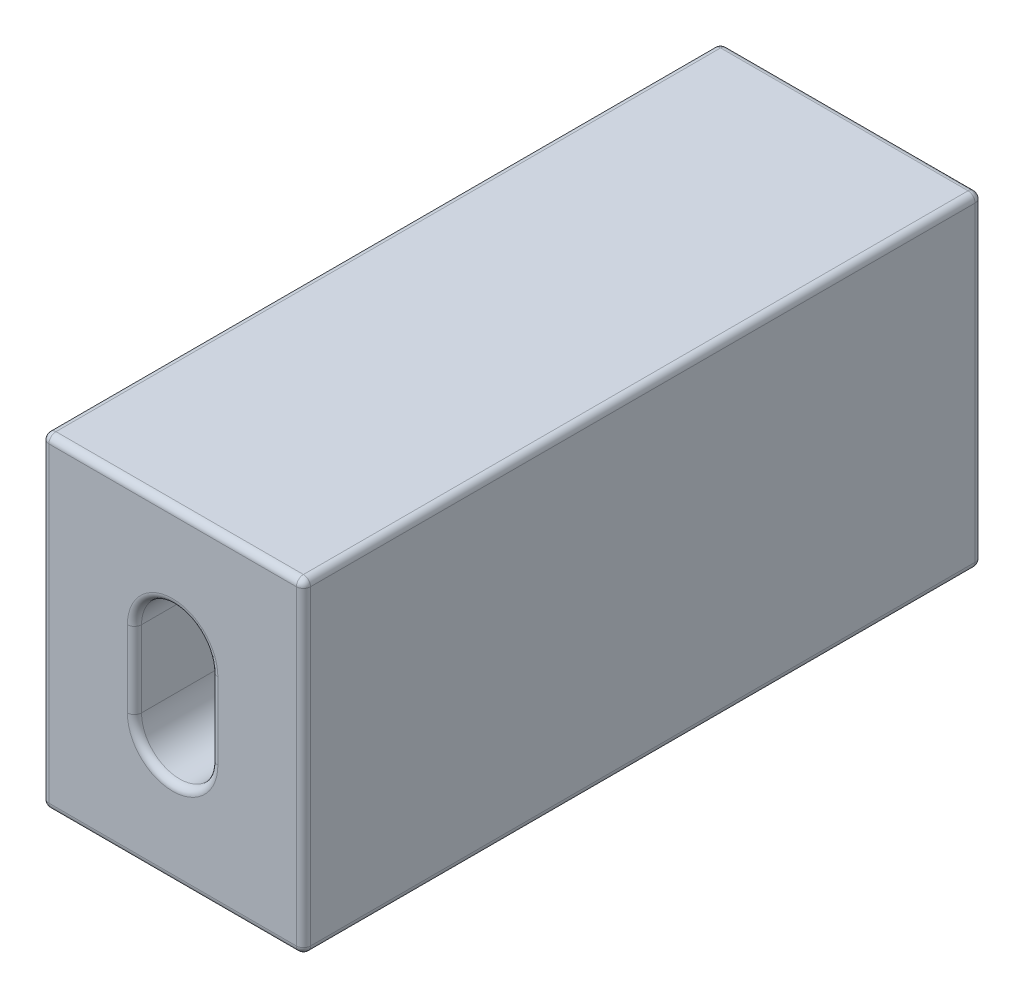
ISO-10303-21;
HEADER;
FILE_DESCRIPTION(('STEP AP214'),'2;1');
FILE_NAME('part.step','',(''),(''),'','','');
FILE_SCHEMA(('AUTOMOTIVE_DESIGN { 1 0 10303 214 1 1 1 1 }'));
ENDSEC;
DATA;
#1=APPLICATION_CONTEXT('core data for automotive mechanical design processes');
#2=APPLICATION_PROTOCOL_DEFINITION('international standard','automotive_design',2000,#1);
#3=PRODUCT_CONTEXT('',#1,'mechanical');
#4=PRODUCT('Part','Part','',(#3));
#5=PRODUCT_RELATED_PRODUCT_CATEGORY('part','',(#4));
#6=PRODUCT_DEFINITION_FORMATION('','',#4);
#7=PRODUCT_DEFINITION_CONTEXT('part definition',#1,'design');
#8=PRODUCT_DEFINITION('design','',#6,#7);
#9=PRODUCT_DEFINITION_SHAPE('','',#8);
#10=(LENGTH_UNIT() NAMED_UNIT(*) SI_UNIT(.MILLI.,.METRE.));
#11=(NAMED_UNIT(*) PLANE_ANGLE_UNIT() SI_UNIT($,.RADIAN.));
#12=(NAMED_UNIT(*) SI_UNIT($,.STERADIAN.) SOLID_ANGLE_UNIT());
#13=UNCERTAINTY_MEASURE_WITH_UNIT(LENGTH_MEASURE(1.E-05),#10,'distance_accuracy_value','');
#14=(GEOMETRIC_REPRESENTATION_CONTEXT(3) GLOBAL_UNCERTAINTY_ASSIGNED_CONTEXT((#13)) GLOBAL_UNIT_ASSIGNED_CONTEXT((#10,
#11,#12)) REPRESENTATION_CONTEXT('',''));
#15=CARTESIAN_POINT('',(0.,0.,0.));
#16=DIRECTION('',(0.,0.,1.));
#17=DIRECTION('',(1.,0.,0.));
#18=AXIS2_PLACEMENT_3D('',#15,#16,#17);
#19=CARTESIAN_POINT('',(0.700000000000002,25.85,48.));
#20=DIRECTION('',(0.,0.,-1.));
#21=DIRECTION('',(-1.,0.,0.));
#22=AXIS2_PLACEMENT_3D('',#19,#20,#21);
#23=PLANE('',#22);
#24=CARTESIAN_POINT('',(9.45,12.1499999999997,48.));
#25=DIRECTION('',(0.,0.,-1.));
#26=DIRECTION('',(-1.,0.,0.));
#27=AXIS2_PLACEMENT_3D('',#24,#25,#26);
#28=CIRCLE('',#27,3.2);
#29=CARTESIAN_POINT('',(12.65,12.1499999999997,48.));
#30=VERTEX_POINT('',#29);
#31=CARTESIAN_POINT('',(6.25,12.1499999999997,48.));
#32=VERTEX_POINT('',#31);
#33=EDGE_CURVE('E345',#30,#32,#28,.T.);
#34=ORIENTED_EDGE('',*,*,#33,.T.);
#35=DIRECTION('',(0.,-1.,0.));
#36=VECTOR('',#35,1.);
#37=CARTESIAN_POINT('',(6.25,17.5499999999997,48.));
#38=LINE('',#37,#36);
#39=CARTESIAN_POINT('',(6.24999999999998,17.5499999999997,48.));
#40=VERTEX_POINT('',#39);
#41=EDGE_CURVE('E348',#32,#40,#38,.F.);
#42=ORIENTED_EDGE('',*,*,#41,.T.);
#43=CARTESIAN_POINT('',(9.44999999999998,17.5499999999997,48.));
#44=DIRECTION('',(0.,0.,-1.));
#45=DIRECTION('',(-1.,0.,0.));
#46=AXIS2_PLACEMENT_3D('',#43,#44,#45);
#47=CIRCLE('',#46,3.2);
#48=CARTESIAN_POINT('',(12.65,17.5499999999997,48.));
#49=VERTEX_POINT('',#48);
#50=EDGE_CURVE('E339',#40,#49,#47,.T.);
#51=ORIENTED_EDGE('',*,*,#50,.T.);
#52=DIRECTION('',(0.,1.,0.));
#53=VECTOR('',#52,1.);
#54=CARTESIAN_POINT('',(12.65,12.1499999999997,48.));
#55=LINE('',#54,#53);
#56=EDGE_CURVE('E342',#49,#30,#55,.F.);
#57=ORIENTED_EDGE('',*,*,#56,.T.);
#58=EDGE_LOOP('',(#34,#42,#51,#57));
#59=FACE_BOUND('',#58,.T.);
#60=DIRECTION('',(0.,1.,0.));
#61=VECTOR('',#60,1.);
#62=CARTESIAN_POINT('',(18.2,25.85,48.));
#63=LINE('',#62,#61);
#64=CARTESIAN_POINT('',(18.2,3.84999999999973,48.));
#65=VERTEX_POINT('',#64);
#66=CARTESIAN_POINT('',(18.2,25.85,48.));
#67=VERTEX_POINT('',#66);
#68=EDGE_CURVE('E332',#65,#67,#63,.T.);
#69=ORIENTED_EDGE('',*,*,#68,.T.);
#70=DIRECTION('',(-1.,0.,0.));
#71=VECTOR('',#70,1.);
#72=CARTESIAN_POINT('',(0.700000000000002,25.85,48.));
#73=LINE('',#72,#71);
#74=CARTESIAN_POINT('',(0.700000000000002,25.85,48.));
#75=VERTEX_POINT('',#74);
#76=EDGE_CURVE('E335',#67,#75,#73,.T.);
#77=ORIENTED_EDGE('',*,*,#76,.T.);
#78=DIRECTION('',(0.,-1.,0.));
#79=VECTOR('',#78,1.);
#80=CARTESIAN_POINT('',(0.700000000000002,25.85,48.));
#81=LINE('',#80,#79);
#82=CARTESIAN_POINT('',(0.700000000000002,3.84999999999973,48.));
#83=VERTEX_POINT('',#82);
#84=EDGE_CURVE('E326',#75,#83,#81,.T.);
#85=ORIENTED_EDGE('',*,*,#84,.T.);
#86=DIRECTION('',(1.,0.,0.));
#87=VECTOR('',#86,1.);
#88=CARTESIAN_POINT('',(0.700000000000002,3.84999999999973,48.));
#89=LINE('',#88,#87);
#90=EDGE_CURVE('E329',#83,#65,#89,.T.);
#91=ORIENTED_EDGE('',*,*,#90,.T.);
#92=EDGE_LOOP('',(#69,#77,#85,#91));
#93=FACE_BOUND('',#92,.T.);
#94=ADVANCED_FACE('F43',(#59,#93),#23,.F.);
#95=CARTESIAN_POINT('',(0.700000000000002,25.85,0.));
#96=DIRECTION('',(0.,0.,-1.));
#97=DIRECTION('',(-1.,0.,0.));
#98=AXIS2_PLACEMENT_3D('',#95,#96,#97);
#99=PLANE('',#98);
#100=DIRECTION('',(0.,-1.,0.));
#101=VECTOR('',#100,1.);
#102=CARTESIAN_POINT('',(6.25,25.85,0.));
#103=LINE('',#102,#101);
#104=CARTESIAN_POINT('',(6.24999999999998,17.5499999999997,0.));
#105=VERTEX_POINT('',#104);
#106=CARTESIAN_POINT('',(6.25,12.1499999999997,0.));
#107=VERTEX_POINT('',#106);
#108=EDGE_CURVE('E236',#105,#107,#103,.T.);
#109=ORIENTED_EDGE('',*,*,#108,.T.);
#110=CARTESIAN_POINT('',(9.45,12.1499999999997,0.));
#111=DIRECTION('',(0.,0.,-1.));
#112=DIRECTION('',(-1.,0.,0.));
#113=AXIS2_PLACEMENT_3D('',#110,#111,#112);
#114=CIRCLE('',#113,3.2);
#115=CARTESIAN_POINT('',(12.65,12.1499999999997,0.));
#116=VERTEX_POINT('',#115);
#117=EDGE_CURVE('E239',#107,#116,#114,.F.);
#118=ORIENTED_EDGE('',*,*,#117,.T.);
#119=DIRECTION('',(0.,1.,0.));
#120=VECTOR('',#119,1.);
#121=CARTESIAN_POINT('',(12.65,25.85,0.));
#122=LINE('',#121,#120);
#123=CARTESIAN_POINT('',(12.65,17.5499999999997,0.));
#124=VERTEX_POINT('',#123);
#125=EDGE_CURVE('E225',#116,#124,#122,.T.);
#126=ORIENTED_EDGE('',*,*,#125,.T.);
#127=CARTESIAN_POINT('',(9.44999999999998,17.5499999999997,0.));
#128=DIRECTION('',(0.,0.,-1.));
#129=DIRECTION('',(-1.,0.,0.));
#130=AXIS2_PLACEMENT_3D('',#127,#128,#129);
#131=CIRCLE('',#130,3.2);
#132=EDGE_CURVE('E229',#124,#105,#131,.F.);
#133=ORIENTED_EDGE('',*,*,#132,.T.);
#134=EDGE_LOOP('',(#109,#118,#126,#133));
#135=FACE_BOUND('',#134,.T.);
#136=DIRECTION('',(1.,0.,0.));
#137=VECTOR('',#136,1.);
#138=CARTESIAN_POINT('',(0.700000000000002,3.84999999999973,0.));
#139=LINE('',#138,#137);
#140=CARTESIAN_POINT('',(18.2,3.84999999999973,0.));
#141=VERTEX_POINT('',#140);
#142=CARTESIAN_POINT('',(0.700000000000002,3.84999999999973,0.));
#143=VERTEX_POINT('',#142);
#144=EDGE_CURVE('E222',#141,#143,#139,.F.);
#145=ORIENTED_EDGE('',*,*,#144,.T.);
#146=DIRECTION('',(0.,-1.,0.));
#147=VECTOR('',#146,1.);
#148=CARTESIAN_POINT('',(0.700000000000002,25.85,0.));
#149=LINE('',#148,#147);
#150=CARTESIAN_POINT('',(0.700000000000002,25.85,0.));
#151=VERTEX_POINT('',#150);
#152=EDGE_CURVE('E188',#143,#151,#149,.F.);
#153=ORIENTED_EDGE('',*,*,#152,.T.);
#154=DIRECTION('',(-1.,0.,0.));
#155=VECTOR('',#154,1.);
#156=CARTESIAN_POINT('',(18.2,25.85,0.));
#157=LINE('',#156,#155);
#158=CARTESIAN_POINT('',(18.2,25.85,0.));
#159=VERTEX_POINT('',#158);
#160=EDGE_CURVE('E210',#151,#159,#157,.F.);
#161=ORIENTED_EDGE('',*,*,#160,.T.);
#162=DIRECTION('',(0.,1.,0.));
#163=VECTOR('',#162,1.);
#164=CARTESIAN_POINT('',(18.2,3.84999999999973,0.));
#165=LINE('',#164,#163);
#166=EDGE_CURVE('E217',#159,#141,#165,.F.);
#167=ORIENTED_EDGE('',*,*,#166,.T.);
#168=EDGE_LOOP('',(#145,#153,#161,#167));
#169=FACE_BOUND('',#168,.T.);
#170=ADVANCED_FACE('F220',(#135,#169),#99,.T.);
#171=CARTESIAN_POINT('',(0.700000000000002,25.85,48.));
#172=DIRECTION('',(0.,0.,-1.));
#173=DIRECTION('',(-1.,0.,0.));
#174=AXIS2_PLACEMENT_3D('',#171,#172,#173);
#175=CYLINDRICAL_SURFACE('',#174,0.5);
#176=DIRECTION('',(0.,0.,-1.));
#177=VECTOR('',#176,1.);
#178=CARTESIAN_POINT('',(0.200000000000002,25.85,48.));
#179=LINE('',#178,#177);
#180=CARTESIAN_POINT('',(0.200000000000002,25.85,47.5));
#181=VERTEX_POINT('',#180);
#182=CARTESIAN_POINT('',(0.200000000000002,25.85,0.5));
#183=VERTEX_POINT('',#182);
#184=EDGE_CURVE('E218',#181,#183,#179,.T.);
#185=ORIENTED_EDGE('',*,*,#184,.F.);
#186=CARTESIAN_POINT('',(0.700000000000002,25.85,47.5));
#187=DIRECTION('',(0.,0.,-1.));
#188=DIRECTION('',(-1.,0.,0.));
#189=AXIS2_PLACEMENT_3D('',#186,#187,#188);
#190=CIRCLE('',#189,0.5);
#191=CARTESIAN_POINT('',(0.700000000000002,26.35,47.5));
#192=VERTEX_POINT('',#191);
#193=EDGE_CURVE('E11',#181,#192,#190,.T.);
#194=ORIENTED_EDGE('',*,*,#193,.T.);
#195=DIRECTION('',(0.,0.,-1.));
#196=VECTOR('',#195,1.);
#197=CARTESIAN_POINT('',(0.700000000000002,26.35,48.));
#198=LINE('',#197,#196);
#199=CARTESIAN_POINT('',(0.700000000000002,26.35,0.5));
#200=VERTEX_POINT('',#199);
#201=EDGE_CURVE('E470',#192,#200,#198,.T.);
#202=ORIENTED_EDGE('',*,*,#201,.T.);
#203=CARTESIAN_POINT('',(0.700000000000002,25.85,0.5));
#204=DIRECTION('',(0.,0.,-1.));
#205=DIRECTION('',(-1.,0.,0.));
#206=AXIS2_PLACEMENT_3D('',#203,#204,#205);
#207=CIRCLE('',#206,0.5);
#208=EDGE_CURVE('E203',#200,#183,#207,.F.);
#209=ORIENTED_EDGE('',*,*,#208,.T.);
#210=EDGE_LOOP('',(#185,#194,#202,#209));
#211=FACE_BOUND('',#210,.T.);
#212=ADVANCED_FACE('F468',(#211),#175,.T.);
#213=CARTESIAN_POINT('',(0.200000000000002,3.84999999999973,48.));
#214=DIRECTION('',(1.,0.,0.));
#215=DIRECTION('',(0.,0.,-1.));
#216=AXIS2_PLACEMENT_3D('',#213,#214,#215);
#217=PLANE('',#216);
#218=DIRECTION('',(0.,0.,-1.));
#219=VECTOR('',#218,1.);
#220=CARTESIAN_POINT('',(0.200000000000002,3.84999999999973,48.));
#221=LINE('',#220,#219);
#222=CARTESIAN_POINT('',(0.200000000000002,3.84999999999973,47.5));
#223=VERTEX_POINT('',#222);
#224=CARTESIAN_POINT('',(0.200000000000002,3.84999999999973,0.5));
#225=VERTEX_POINT('',#224);
#226=EDGE_CURVE('E441',#223,#225,#221,.T.);
#227=ORIENTED_EDGE('',*,*,#226,.F.);
#228=DIRECTION('',(0.,-1.,0.));
#229=VECTOR('',#228,1.);
#230=CARTESIAN_POINT('',(0.200000000000002,3.84999999999973,47.5));
#231=LINE('',#230,#229);
#232=EDGE_CURVE('E53',#223,#181,#231,.F.);
#233=ORIENTED_EDGE('',*,*,#232,.T.);
#234=ORIENTED_EDGE('',*,*,#184,.T.);
#235=DIRECTION('',(0.,-1.,0.));
#236=VECTOR('',#235,1.);
#237=CARTESIAN_POINT('',(0.200000000000002,3.84999999999973,0.5));
#238=LINE('',#237,#236);
#239=EDGE_CURVE('E191',#183,#225,#238,.T.);
#240=ORIENTED_EDGE('',*,*,#239,.T.);
#241=EDGE_LOOP('',(#227,#233,#234,#240));
#242=FACE_BOUND('',#241,.T.);
#243=ADVANCED_FACE('F465',(#242),#217,.F.);
#244=CARTESIAN_POINT('',(0.700000000000002,3.84999999999973,48.));
#245=DIRECTION('',(0.,0.,-1.));
#246=DIRECTION('',(-1.,0.,0.));
#247=AXIS2_PLACEMENT_3D('',#244,#245,#246);
#248=CYLINDRICAL_SURFACE('',#247,0.5);
#249=DIRECTION('',(0.,0.,-1.));
#250=VECTOR('',#249,1.);
#251=CARTESIAN_POINT('',(0.700000000000002,3.34999999999973,48.));
#252=LINE('',#251,#250);
#253=CARTESIAN_POINT('',(0.700000000000002,3.34999999999973,47.5));
#254=VERTEX_POINT('',#253);
#255=CARTESIAN_POINT('',(0.700000000000002,3.34999999999973,0.5));
#256=VERTEX_POINT('',#255);
#257=EDGE_CURVE('E435',#254,#256,#252,.T.);
#258=ORIENTED_EDGE('',*,*,#257,.F.);
#259=CARTESIAN_POINT('',(0.700000000000002,3.84999999999973,47.5));
#260=DIRECTION('',(0.,0.,-1.));
#261=DIRECTION('',(-1.,0.,0.));
#262=AXIS2_PLACEMENT_3D('',#259,#260,#261);
#263=CIRCLE('',#262,0.5);
#264=EDGE_CURVE('E68',#254,#223,#263,.T.);
#265=ORIENTED_EDGE('',*,*,#264,.T.);
#266=ORIENTED_EDGE('',*,*,#226,.T.);
#267=CARTESIAN_POINT('',(0.700000000000002,3.84999999999973,0.5));
#268=DIRECTION('',(0.,0.,-1.));
#269=DIRECTION('',(-1.,0.,0.));
#270=AXIS2_PLACEMENT_3D('',#267,#268,#269);
#271=CIRCLE('',#270,0.5);
#272=EDGE_CURVE('E261',#225,#256,#271,.F.);
#273=ORIENTED_EDGE('',*,*,#272,.T.);
#274=EDGE_LOOP('',(#258,#265,#266,#273));
#275=FACE_BOUND('',#274,.T.);
#276=ADVANCED_FACE('F437',(#275),#248,.T.);
#277=CARTESIAN_POINT('',(0.700000000000002,3.34999999999973,48.));
#278=DIRECTION('',(0.,1.,0.));
#279=DIRECTION('',(0.,0.,1.));
#280=AXIS2_PLACEMENT_3D('',#277,#278,#279);
#281=PLANE('',#280);
#282=DIRECTION('',(0.,0.,-1.));
#283=VECTOR('',#282,1.);
#284=CARTESIAN_POINT('',(18.2,3.34999999999973,48.));
#285=LINE('',#284,#283);
#286=CARTESIAN_POINT('',(18.2,3.34999999999973,47.5));
#287=VERTEX_POINT('',#286);
#288=CARTESIAN_POINT('',(18.2,3.34999999999973,0.5));
#289=VERTEX_POINT('',#288);
#290=EDGE_CURVE('E436',#287,#289,#285,.T.);
#291=ORIENTED_EDGE('',*,*,#290,.F.);
#292=DIRECTION('',(1.,0.,0.));
#293=VECTOR('',#292,1.);
#294=CARTESIAN_POINT('',(0.700000000000002,3.34999999999973,47.5));
#295=LINE('',#294,#293);
#296=EDGE_CURVE('E374',#287,#254,#295,.F.);
#297=ORIENTED_EDGE('',*,*,#296,.T.);
#298=ORIENTED_EDGE('',*,*,#257,.T.);
#299=DIRECTION('',(1.,0.,0.));
#300=VECTOR('',#299,1.);
#301=CARTESIAN_POINT('',(18.2,3.34999999999973,0.5));
#302=LINE('',#301,#300);
#303=EDGE_CURVE('E265',#256,#289,#302,.T.);
#304=ORIENTED_EDGE('',*,*,#303,.T.);
#305=EDGE_LOOP('',(#291,#297,#298,#304));
#306=FACE_BOUND('',#305,.T.);
#307=ADVANCED_FACE('F434',(#306),#281,.F.);
#308=CARTESIAN_POINT('',(18.2,3.84999999999973,48.));
#309=DIRECTION('',(0.,0.,-1.));
#310=DIRECTION('',(-1.,0.,0.));
#311=AXIS2_PLACEMENT_3D('',#308,#309,#310);
#312=CYLINDRICAL_SURFACE('',#311,0.5);
#313=DIRECTION('',(0.,0.,-1.));
#314=VECTOR('',#313,1.);
#315=CARTESIAN_POINT('',(18.7,3.84999999999973,48.));
#316=LINE('',#315,#314);
#317=CARTESIAN_POINT('',(18.7,3.84999999999973,47.5));
#318=VERTEX_POINT('',#317);
#319=CARTESIAN_POINT('',(18.7,3.84999999999973,0.5));
#320=VERTEX_POINT('',#319);
#321=EDGE_CURVE('E446',#318,#320,#316,.T.);
#322=ORIENTED_EDGE('',*,*,#321,.F.);
#323=CARTESIAN_POINT('',(18.2,3.84999999999973,47.5));
#324=DIRECTION('',(0.,0.,-1.));
#325=DIRECTION('',(-1.,0.,0.));
#326=AXIS2_PLACEMENT_3D('',#323,#324,#325);
#327=CIRCLE('',#326,0.5);
#328=EDGE_CURVE('E371',#318,#287,#327,.T.);
#329=ORIENTED_EDGE('',*,*,#328,.T.);
#330=ORIENTED_EDGE('',*,*,#290,.T.);
#331=CARTESIAN_POINT('',(18.2,3.84999999999973,0.5));
#332=DIRECTION('',(0.,0.,-1.));
#333=DIRECTION('',(-1.,0.,0.));
#334=AXIS2_PLACEMENT_3D('',#331,#332,#333);
#335=CIRCLE('',#334,0.5);
#336=EDGE_CURVE('E269',#289,#320,#335,.F.);
#337=ORIENTED_EDGE('',*,*,#336,.T.);
#338=EDGE_LOOP('',(#322,#329,#330,#337));
#339=FACE_BOUND('',#338,.T.);
#340=ADVANCED_FACE('F518',(#339),#312,.T.);
#341=CARTESIAN_POINT('',(18.7,3.84999999999973,48.));
#342=DIRECTION('',(-1.,0.,0.));
#343=DIRECTION('',(0.,0.,1.));
#344=AXIS2_PLACEMENT_3D('',#341,#342,#343);
#345=PLANE('',#344);
#346=DIRECTION('',(0.,0.,-1.));
#347=VECTOR('',#346,1.);
#348=CARTESIAN_POINT('',(18.7,25.85,48.));
#349=LINE('',#348,#347);
#350=CARTESIAN_POINT('',(18.7,25.85,47.5));
#351=VERTEX_POINT('',#350);
#352=CARTESIAN_POINT('',(18.7,25.85,0.5));
#353=VERTEX_POINT('',#352);
#354=EDGE_CURVE('E482',#351,#353,#349,.T.);
#355=ORIENTED_EDGE('',*,*,#354,.F.);
#356=DIRECTION('',(0.,1.,0.));
#357=VECTOR('',#356,1.);
#358=CARTESIAN_POINT('',(18.7,3.84999999999973,47.5));
#359=LINE('',#358,#357);
#360=EDGE_CURVE('E368',#351,#318,#359,.F.);
#361=ORIENTED_EDGE('',*,*,#360,.T.);
#362=ORIENTED_EDGE('',*,*,#321,.T.);
#363=DIRECTION('',(0.,1.,0.));
#364=VECTOR('',#363,1.);
#365=CARTESIAN_POINT('',(18.7,25.85,0.5));
#366=LINE('',#365,#364);
#367=EDGE_CURVE('E273',#320,#353,#366,.T.);
#368=ORIENTED_EDGE('',*,*,#367,.T.);
#369=EDGE_LOOP('',(#355,#361,#362,#368));
#370=FACE_BOUND('',#369,.T.);
#371=ADVANCED_FACE('F515',(#370),#345,.F.);
#372=CARTESIAN_POINT('',(18.2,25.85,48.));
#373=DIRECTION('',(0.,0.,-1.));
#374=DIRECTION('',(-1.,0.,0.));
#375=AXIS2_PLACEMENT_3D('',#372,#373,#374);
#376=CYLINDRICAL_SURFACE('',#375,0.5);
#377=DIRECTION('',(0.,0.,-1.));
#378=VECTOR('',#377,1.);
#379=CARTESIAN_POINT('',(18.2,26.35,48.));
#380=LINE('',#379,#378);
#381=CARTESIAN_POINT('',(18.2,26.35,47.5));
#382=VERTEX_POINT('',#381);
#383=CARTESIAN_POINT('',(18.2,26.35,0.5));
#384=VERTEX_POINT('',#383);
#385=EDGE_CURVE('E475',#382,#384,#380,.T.);
#386=ORIENTED_EDGE('',*,*,#385,.F.);
#387=CARTESIAN_POINT('',(18.2,25.85,47.5));
#388=DIRECTION('',(0.,0.,-1.));
#389=DIRECTION('',(-1.,0.,0.));
#390=AXIS2_PLACEMENT_3D('',#387,#388,#389);
#391=CIRCLE('',#390,0.5);
#392=EDGE_CURVE('E365',#382,#351,#391,.T.);
#393=ORIENTED_EDGE('',*,*,#392,.T.);
#394=ORIENTED_EDGE('',*,*,#354,.T.);
#395=CARTESIAN_POINT('',(18.2,25.85,0.5));
#396=DIRECTION('',(0.,0.,-1.));
#397=DIRECTION('',(-1.,0.,0.));
#398=AXIS2_PLACEMENT_3D('',#395,#396,#397);
#399=CIRCLE('',#398,0.5);
#400=EDGE_CURVE('E277',#353,#384,#399,.F.);
#401=ORIENTED_EDGE('',*,*,#400,.T.);
#402=EDGE_LOOP('',(#386,#393,#394,#401));
#403=FACE_BOUND('',#402,.T.);
#404=ADVANCED_FACE('F485',(#403),#376,.T.);
#405=CARTESIAN_POINT('',(0.700000000000002,26.35,48.));
#406=DIRECTION('',(0.,-1.,0.));
#407=DIRECTION('',(0.,0.,-1.));
#408=AXIS2_PLACEMENT_3D('',#405,#406,#407);
#409=PLANE('',#408);
#410=ORIENTED_EDGE('',*,*,#201,.F.);
#411=DIRECTION('',(-1.,0.,0.));
#412=VECTOR('',#411,1.);
#413=CARTESIAN_POINT('',(0.700000000000002,26.35,47.5));
#414=LINE('',#413,#412);
#415=EDGE_CURVE('E361',#192,#382,#414,.F.);
#416=ORIENTED_EDGE('',*,*,#415,.T.);
#417=ORIENTED_EDGE('',*,*,#385,.T.);
#418=DIRECTION('',(-1.,0.,0.));
#419=VECTOR('',#418,1.);
#420=CARTESIAN_POINT('',(0.700000000000002,26.35,0.5));
#421=LINE('',#420,#419);
#422=EDGE_CURVE('E281',#384,#200,#421,.T.);
#423=ORIENTED_EDGE('',*,*,#422,.T.);
#424=EDGE_LOOP('',(#410,#416,#417,#423));
#425=FACE_BOUND('',#424,.T.);
#426=ADVANCED_FACE('F478',(#425),#409,.F.);
#427=CARTESIAN_POINT('',(9.44999999999998,17.5499999999997,48.));
#428=DIRECTION('',(0.,0.,-1.));
#429=DIRECTION('',(-1.,0.,0.));
#430=AXIS2_PLACEMENT_3D('',#427,#428,#429);
#431=CYLINDRICAL_SURFACE('',#430,2.7);
#432=DIRECTION('',(0.,0.,-1.));
#433=VECTOR('',#432,1.);
#434=CARTESIAN_POINT('',(12.15,17.5499999999997,48.));
#435=LINE('',#434,#433);
#436=CARTESIAN_POINT('',(12.15,17.5499999999997,47.5));
#437=VERTEX_POINT('',#436);
#438=CARTESIAN_POINT('',(12.15,17.5499999999997,0.5));
#439=VERTEX_POINT('',#438);
#440=EDGE_CURVE('E304',#437,#439,#435,.T.);
#441=ORIENTED_EDGE('',*,*,#440,.F.);
#442=CARTESIAN_POINT('',(9.44999999999998,17.5499999999997,47.5));
#443=DIRECTION('',(0.,0.,-1.));
#444=DIRECTION('',(-1.,0.,0.));
#445=AXIS2_PLACEMENT_3D('',#442,#443,#444);
#446=CIRCLE('',#445,2.7);
#447=CARTESIAN_POINT('',(6.75,17.5499999999997,47.5));
#448=VERTEX_POINT('',#447);
#449=EDGE_CURVE('E358',#437,#448,#446,.F.);
#450=ORIENTED_EDGE('',*,*,#449,.T.);
#451=DIRECTION('',(0.,0.,-1.));
#452=VECTOR('',#451,1.);
#453=CARTESIAN_POINT('',(6.75,17.5499999999997,48.));
#454=LINE('',#453,#452);
#455=CARTESIAN_POINT('',(6.75,17.5499999999997,0.5));
#456=VERTEX_POINT('',#455);
#457=EDGE_CURVE('E476',#448,#456,#454,.T.);
#458=ORIENTED_EDGE('',*,*,#457,.T.);
#459=CARTESIAN_POINT('',(9.44999999999998,17.5499999999997,0.5));
#460=DIRECTION('',(0.,0.,-1.));
#461=DIRECTION('',(-1.,0.,0.));
#462=AXIS2_PLACEMENT_3D('',#459,#460,#461);
#463=CIRCLE('',#462,2.7);
#464=EDGE_CURVE('E251',#456,#439,#463,.T.);
#465=ORIENTED_EDGE('',*,*,#464,.T.);
#466=EDGE_LOOP('',(#441,#450,#458,#465));
#467=FACE_BOUND('',#466,.T.);
#468=ADVANCED_FACE('F508',(#467),#431,.F.);
#469=CARTESIAN_POINT('',(6.75,17.5499999999997,48.));
#470=DIRECTION('',(1.,0.,0.));
#471=DIRECTION('',(0.,1.,0.));
#472=AXIS2_PLACEMENT_3D('',#469,#470,#471);
#473=PLANE('',#472);
#474=ORIENTED_EDGE('',*,*,#457,.F.);
#475=DIRECTION('',(0.,-1.,0.));
#476=VECTOR('',#475,1.);
#477=CARTESIAN_POINT('',(6.75,12.1499999999997,47.5));
#478=LINE('',#477,#476);
#479=CARTESIAN_POINT('',(6.75,12.1499999999997,47.5));
#480=VERTEX_POINT('',#479);
#481=EDGE_CURVE('E287',#448,#480,#478,.T.);
#482=ORIENTED_EDGE('',*,*,#481,.T.);
#483=DIRECTION('',(0.,0.,-1.));
#484=VECTOR('',#483,1.);
#485=CARTESIAN_POINT('',(6.75,12.1499999999997,48.));
#486=LINE('',#485,#484);
#487=CARTESIAN_POINT('',(6.75,12.1499999999997,0.5));
#488=VERTEX_POINT('',#487);
#489=EDGE_CURVE('E928',#480,#488,#486,.T.);
#490=ORIENTED_EDGE('',*,*,#489,.T.);
#491=DIRECTION('',(0.,-1.,0.));
#492=VECTOR('',#491,1.);
#493=CARTESIAN_POINT('',(6.75,17.5499999999997,0.5));
#494=LINE('',#493,#492);
#495=EDGE_CURVE('E247',#488,#456,#494,.F.);
#496=ORIENTED_EDGE('',*,*,#495,.T.);
#497=EDGE_LOOP('',(#474,#482,#490,#496));
#498=FACE_BOUND('',#497,.T.);
#499=ADVANCED_FACE('F801',(#498),#473,.T.);
#500=CARTESIAN_POINT('',(9.45,12.1499999999997,48.));
#501=DIRECTION('',(0.,0.,-1.));
#502=DIRECTION('',(-1.,0.,0.));
#503=AXIS2_PLACEMENT_3D('',#500,#501,#502);
#504=CYLINDRICAL_SURFACE('',#503,2.7);
#505=ORIENTED_EDGE('',*,*,#489,.F.);
#506=CARTESIAN_POINT('',(9.45,12.1499999999997,47.5));
#507=DIRECTION('',(0.,0.,-1.));
#508=DIRECTION('',(-1.,0.,0.));
#509=AXIS2_PLACEMENT_3D('',#506,#507,#508);
#510=CIRCLE('',#509,2.7);
#511=CARTESIAN_POINT('',(12.15,12.1499999999997,47.5));
#512=VERTEX_POINT('',#511);
#513=EDGE_CURVE('E352',#480,#512,#510,.F.);
#514=ORIENTED_EDGE('',*,*,#513,.T.);
#515=DIRECTION('',(0.,0.,-1.));
#516=VECTOR('',#515,1.);
#517=CARTESIAN_POINT('',(12.15,12.1499999999997,48.));
#518=LINE('',#517,#516);
#519=CARTESIAN_POINT('',(12.15,12.1499999999997,0.5));
#520=VERTEX_POINT('',#519);
#521=EDGE_CURVE('E916',#512,#520,#518,.T.);
#522=ORIENTED_EDGE('',*,*,#521,.T.);
#523=CARTESIAN_POINT('',(9.45,12.1499999999997,0.5));
#524=DIRECTION('',(0.,0.,-1.));
#525=DIRECTION('',(-1.,0.,0.));
#526=AXIS2_PLACEMENT_3D('',#523,#524,#525);
#527=CIRCLE('',#526,2.7);
#528=EDGE_CURVE('E243',#520,#488,#527,.T.);
#529=ORIENTED_EDGE('',*,*,#528,.T.);
#530=EDGE_LOOP('',(#505,#514,#522,#529));
#531=FACE_BOUND('',#530,.T.);
#532=ADVANCED_FACE('F790',(#531),#504,.F.);
#533=CARTESIAN_POINT('',(12.15,17.5499999999997,48.));
#534=DIRECTION('',(-1.,0.,0.));
#535=DIRECTION('',(0.,0.,1.));
#536=AXIS2_PLACEMENT_3D('',#533,#534,#535);
#537=PLANE('',#536);
#538=ORIENTED_EDGE('',*,*,#521,.F.);
#539=DIRECTION('',(0.,1.,0.));
#540=VECTOR('',#539,1.);
#541=CARTESIAN_POINT('',(12.15,17.5499999999997,47.5));
#542=LINE('',#541,#540);
#543=EDGE_CURVE('E355',#512,#437,#542,.T.);
#544=ORIENTED_EDGE('',*,*,#543,.T.);
#545=ORIENTED_EDGE('',*,*,#440,.T.);
#546=DIRECTION('',(0.,1.,0.));
#547=VECTOR('',#546,1.);
#548=CARTESIAN_POINT('',(12.15,17.5499999999997,0.5));
#549=LINE('',#548,#547);
#550=EDGE_CURVE('E255',#439,#520,#549,.F.);
#551=ORIENTED_EDGE('',*,*,#550,.T.);
#552=EDGE_LOOP('',(#538,#544,#545,#551));
#553=FACE_BOUND('',#552,.T.);
#554=ADVANCED_FACE('F545',(#553),#537,.T.);
#555=CARTESIAN_POINT('',(9.44999999999998,17.5499999999997,0.5));
#556=DIRECTION('',(0.,0.,-1.));
#557=DIRECTION('',(-1.,0.,0.));
#558=AXIS2_PLACEMENT_3D('',#555,#556,#557);
#559=TOROIDAL_SURFACE('',#558,3.2,0.5);
#560=CARTESIAN_POINT('',(12.65,17.5499999999997,0.5));
#561=DIRECTION('',(0.,-1.,0.));
#562=DIRECTION('',(0.,0.,-1.));
#563=AXIS2_PLACEMENT_3D('',#560,#561,#562);
#564=CIRCLE('',#563,0.5);
#565=EDGE_CURVE('E296',#439,#124,#564,.T.);
#566=ORIENTED_EDGE('',*,*,#565,.F.);
#567=ORIENTED_EDGE('',*,*,#464,.F.);
#568=CARTESIAN_POINT('',(6.24999999999998,17.5499999999997,0.5));
#569=DIRECTION('',(0.,-1.,0.));
#570=DIRECTION('',(0.,0.,-1.));
#571=AXIS2_PLACEMENT_3D('',#568,#569,#570);
#572=CIRCLE('',#571,0.5);
#573=EDGE_CURVE('E300',#105,#456,#572,.T.);
#574=ORIENTED_EDGE('',*,*,#573,.F.);
#575=ORIENTED_EDGE('',*,*,#132,.F.);
#576=EDGE_LOOP('',(#566,#567,#574,#575));
#577=FACE_BOUND('',#576,.T.);
#578=ADVANCED_FACE('F541',(#577),#559,.T.);
#579=CARTESIAN_POINT('',(6.25,25.85,0.5));
#580=DIRECTION('',(0.,-1.,0.));
#581=DIRECTION('',(1.,0.,0.));
#582=AXIS2_PLACEMENT_3D('',#579,#580,#581);
#583=CYLINDRICAL_SURFACE('',#582,0.5);
#584=ORIENTED_EDGE('',*,*,#573,.T.);
#585=ORIENTED_EDGE('',*,*,#495,.F.);
#586=CARTESIAN_POINT('',(6.25,12.1499999999997,0.5));
#587=DIRECTION('',(0.,-1.,0.));
#588=DIRECTION('',(0.,0.,-1.));
#589=AXIS2_PLACEMENT_3D('',#586,#587,#588);
#590=CIRCLE('',#589,0.5);
#591=EDGE_CURVE('E291',#107,#488,#590,.T.);
#592=ORIENTED_EDGE('',*,*,#591,.F.);
#593=ORIENTED_EDGE('',*,*,#108,.F.);
#594=EDGE_LOOP('',(#584,#585,#592,#593));
#595=FACE_BOUND('',#594,.T.);
#596=ADVANCED_FACE('F537',(#595),#583,.T.);
#597=CARTESIAN_POINT('',(12.65,25.85,0.5));
#598=DIRECTION('',(0.,1.,0.));
#599=DIRECTION('',(0.,0.,1.));
#600=AXIS2_PLACEMENT_3D('',#597,#598,#599);
#601=CYLINDRICAL_SURFACE('',#600,0.5);
#602=ORIENTED_EDGE('',*,*,#565,.T.);
#603=ORIENTED_EDGE('',*,*,#125,.F.);
#604=CARTESIAN_POINT('',(12.65,12.1499999999997,0.5));
#605=DIRECTION('',(0.,-1.,0.));
#606=DIRECTION('',(0.,0.,-1.));
#607=AXIS2_PLACEMENT_3D('',#604,#605,#606);
#608=CIRCLE('',#607,0.5);
#609=EDGE_CURVE('E288',#520,#116,#608,.T.);
#610=ORIENTED_EDGE('',*,*,#609,.F.);
#611=ORIENTED_EDGE('',*,*,#550,.F.);
#612=EDGE_LOOP('',(#602,#603,#610,#611));
#613=FACE_BOUND('',#612,.T.);
#614=ADVANCED_FACE('F533',(#613),#601,.T.);
#615=CARTESIAN_POINT('',(9.45,12.1499999999997,0.5));
#616=DIRECTION('',(0.,0.,-1.));
#617=DIRECTION('',(-1.,0.,0.));
#618=AXIS2_PLACEMENT_3D('',#615,#616,#617);
#619=TOROIDAL_SURFACE('',#618,3.2,0.5);
#620=ORIENTED_EDGE('',*,*,#591,.T.);
#621=ORIENTED_EDGE('',*,*,#528,.F.);
#622=ORIENTED_EDGE('',*,*,#609,.T.);
#623=ORIENTED_EDGE('',*,*,#117,.F.);
#624=EDGE_LOOP('',(#620,#621,#622,#623));
#625=FACE_BOUND('',#624,.T.);
#626=ADVANCED_FACE('F496',(#625),#619,.T.);
#627=CARTESIAN_POINT('',(18.2,3.84999999999973,0.5));
#628=DIRECTION('',(0.,-1.,0.));
#629=DIRECTION('',(0.,0.,-1.));
#630=AXIS2_PLACEMENT_3D('',#627,#628,#629);
#631=CYLINDRICAL_SURFACE('',#630,0.5);
#632=CARTESIAN_POINT('',(18.2,25.85,0.5));
#633=DIRECTION('',(0.,1.,0.));
#634=DIRECTION('',(0.,0.,1.));
#635=AXIS2_PLACEMENT_3D('',#632,#633,#634);
#636=CIRCLE('',#635,0.5);
#637=EDGE_CURVE('E292',#353,#159,#636,.T.);
#638=ORIENTED_EDGE('',*,*,#637,.F.);
#639=ORIENTED_EDGE('',*,*,#367,.F.);
#640=CARTESIAN_POINT('',(18.2,3.84999999999973,0.5));
#641=DIRECTION('',(0.,-1.,0.));
#642=DIRECTION('',(0.,0.,-1.));
#643=AXIS2_PLACEMENT_3D('',#640,#641,#642);
#644=CIRCLE('',#643,0.5);
#645=EDGE_CURVE('E316',#141,#320,#644,.T.);
#646=ORIENTED_EDGE('',*,*,#645,.F.);
#647=ORIENTED_EDGE('',*,*,#166,.F.);
#648=EDGE_LOOP('',(#638,#639,#646,#647));
#649=FACE_BOUND('',#648,.T.);
#650=ADVANCED_FACE('F457',(#649),#631,.T.);
#651=CARTESIAN_POINT('',(18.2,25.85,0.5));
#652=DIRECTION('',(0.,0.,-1.));
#653=DIRECTION('',(-1.,0.,0.));
#654=AXIS2_PLACEMENT_3D('',#651,#652,#653);
#655=SPHERICAL_SURFACE('',#654,0.5);
#656=ORIENTED_EDGE('',*,*,#400,.F.);
#657=ORIENTED_EDGE('',*,*,#637,.T.);
#658=CARTESIAN_POINT('',(18.2,25.85,0.5));
#659=DIRECTION('',(-1.,0.,0.));
#660=DIRECTION('',(0.,0.,1.));
#661=AXIS2_PLACEMENT_3D('',#658,#659,#660);
#662=CIRCLE('',#661,0.5);
#663=EDGE_CURVE('E213',#384,#159,#662,.T.);
#664=ORIENTED_EDGE('',*,*,#663,.F.);
#665=EDGE_LOOP('',(#656,#657,#664));
#666=FACE_BOUND('',#665,.T.);
#667=ADVANCED_FACE('F488',(#666),#655,.T.);
#668=CARTESIAN_POINT('',(18.2,3.84999999999973,0.5));
#669=DIRECTION('',(0.,0.,-1.));
#670=DIRECTION('',(-1.,0.,0.));
#671=AXIS2_PLACEMENT_3D('',#668,#669,#670);
#672=SPHERICAL_SURFACE('',#671,0.5);
#673=ORIENTED_EDGE('',*,*,#645,.T.);
#674=ORIENTED_EDGE('',*,*,#336,.F.);
#675=CARTESIAN_POINT('',(18.2,3.84999999999973,0.5));
#676=DIRECTION('',(-1.,0.,0.));
#677=DIRECTION('',(0.,0.,1.));
#678=AXIS2_PLACEMENT_3D('',#675,#676,#677);
#679=CIRCLE('',#678,0.5);
#680=EDGE_CURVE('E207',#141,#289,#679,.T.);
#681=ORIENTED_EDGE('',*,*,#680,.F.);
#682=EDGE_LOOP('',(#673,#674,#681));
#683=FACE_BOUND('',#682,.T.);
#684=ADVANCED_FACE('F460',(#683),#672,.T.);
#685=CARTESIAN_POINT('',(0.700000000000002,25.85,0.5));
#686=DIRECTION('',(1.,0.,0.));
#687=DIRECTION('',(0.,0.,-1.));
#688=AXIS2_PLACEMENT_3D('',#685,#686,#687);
#689=CYLINDRICAL_SURFACE('',#688,0.5);
#690=ORIENTED_EDGE('',*,*,#663,.T.);
#691=ORIENTED_EDGE('',*,*,#160,.F.);
#692=CARTESIAN_POINT('',(0.700000000000002,25.85,0.5));
#693=DIRECTION('',(-1.,0.,0.));
#694=DIRECTION('',(0.,0.,1.));
#695=AXIS2_PLACEMENT_3D('',#692,#693,#694);
#696=CIRCLE('',#695,0.5);
#697=EDGE_CURVE('E199',#200,#151,#696,.T.);
#698=ORIENTED_EDGE('',*,*,#697,.F.);
#699=ORIENTED_EDGE('',*,*,#422,.F.);
#700=EDGE_LOOP('',(#690,#691,#698,#699));
#701=FACE_BOUND('',#700,.T.);
#702=ADVANCED_FACE('F211',(#701),#689,.T.);
#703=CARTESIAN_POINT('',(0.700000000000002,3.84999999999973,0.5));
#704=DIRECTION('',(-1.,0.,0.));
#705=DIRECTION('',(0.,0.,1.));
#706=AXIS2_PLACEMENT_3D('',#703,#704,#705);
#707=CYLINDRICAL_SURFACE('',#706,0.5);
#708=ORIENTED_EDGE('',*,*,#680,.T.);
#709=ORIENTED_EDGE('',*,*,#303,.F.);
#710=CARTESIAN_POINT('',(0.700000000000002,3.84999999999973,0.5));
#711=DIRECTION('',(-1.,0.,0.));
#712=DIRECTION('',(0.,-1.,0.));
#713=AXIS2_PLACEMENT_3D('',#710,#711,#712);
#714=CIRCLE('',#713,0.5);
#715=EDGE_CURVE('E195',#143,#256,#714,.T.);
#716=ORIENTED_EDGE('',*,*,#715,.F.);
#717=ORIENTED_EDGE('',*,*,#144,.F.);
#718=EDGE_LOOP('',(#708,#709,#716,#717));
#719=FACE_BOUND('',#718,.T.);
#720=ADVANCED_FACE('F462',(#719),#707,.T.);
#721=CARTESIAN_POINT('',(0.700000000000002,25.85,0.5));
#722=DIRECTION('',(0.,0.,-1.));
#723=DIRECTION('',(-1.,0.,0.));
#724=AXIS2_PLACEMENT_3D('',#721,#722,#723);
#725=SPHERICAL_SURFACE('',#724,0.5);
#726=ORIENTED_EDGE('',*,*,#208,.F.);
#727=ORIENTED_EDGE('',*,*,#697,.T.);
#728=CARTESIAN_POINT('',(0.700000000000002,25.85,0.5));
#729=DIRECTION('',(0.,-1.,0.));
#730=DIRECTION('',(0.,0.,-1.));
#731=AXIS2_PLACEMENT_3D('',#728,#729,#730);
#732=CIRCLE('',#731,0.5);
#733=EDGE_CURVE('E183',#183,#151,#732,.T.);
#734=ORIENTED_EDGE('',*,*,#733,.F.);
#735=EDGE_LOOP('',(#726,#727,#734));
#736=FACE_BOUND('',#735,.T.);
#737=ADVANCED_FACE('F201',(#736),#725,.T.);
#738=CARTESIAN_POINT('',(0.700000000000002,3.84999999999973,0.5));
#739=DIRECTION('',(0.,0.,-1.));
#740=DIRECTION('',(-1.,0.,0.));
#741=AXIS2_PLACEMENT_3D('',#738,#739,#740);
#742=SPHERICAL_SURFACE('',#741,0.5);
#743=ORIENTED_EDGE('',*,*,#715,.T.);
#744=ORIENTED_EDGE('',*,*,#272,.F.);
#745=CARTESIAN_POINT('',(0.700000000000002,3.84999999999973,0.5));
#746=DIRECTION('',(0.,1.,0.));
#747=DIRECTION('',(0.,0.,1.));
#748=AXIS2_PLACEMENT_3D('',#745,#746,#747);
#749=CIRCLE('',#748,0.5);
#750=EDGE_CURVE('E196',#143,#225,#749,.T.);
#751=ORIENTED_EDGE('',*,*,#750,.F.);
#752=EDGE_LOOP('',(#743,#744,#751));
#753=FACE_BOUND('',#752,.T.);
#754=ADVANCED_FACE('F464',(#753),#742,.T.);
#755=CARTESIAN_POINT('',(0.700000000000002,3.84999999999973,0.5));
#756=DIRECTION('',(0.,1.,0.));
#757=DIRECTION('',(0.,0.,1.));
#758=AXIS2_PLACEMENT_3D('',#755,#756,#757);
#759=CYLINDRICAL_SURFACE('',#758,0.5);
#760=ORIENTED_EDGE('',*,*,#733,.T.);
#761=ORIENTED_EDGE('',*,*,#152,.F.);
#762=ORIENTED_EDGE('',*,*,#750,.T.);
#763=ORIENTED_EDGE('',*,*,#239,.F.);
#764=EDGE_LOOP('',(#760,#761,#762,#763));
#765=FACE_BOUND('',#764,.T.);
#766=ADVANCED_FACE('F185',(#765),#759,.T.);
#767=CARTESIAN_POINT('',(12.65,17.5499999999997,47.5));
#768=DIRECTION('',(0.,-1.,0.));
#769=DIRECTION('',(0.,0.,-1.));
#770=AXIS2_PLACEMENT_3D('',#767,#768,#769);
#771=CYLINDRICAL_SURFACE('',#770,0.5);
#772=CARTESIAN_POINT('',(12.65,12.1499999999997,47.5));
#773=DIRECTION('',(0.,-1.,0.));
#774=DIRECTION('',(0.,0.,-1.));
#775=AXIS2_PLACEMENT_3D('',#772,#773,#774);
#776=CIRCLE('',#775,0.5);
#777=EDGE_CURVE('E387',#30,#512,#776,.T.);
#778=ORIENTED_EDGE('',*,*,#777,.F.);
#779=ORIENTED_EDGE('',*,*,#56,.F.);
#780=CARTESIAN_POINT('',(12.65,17.5499999999997,47.5));
#781=DIRECTION('',(0.,1.,0.));
#782=DIRECTION('',(0.,0.,1.));
#783=AXIS2_PLACEMENT_3D('',#780,#781,#782);
#784=CIRCLE('',#783,0.5);
#785=EDGE_CURVE('E306',#437,#49,#784,.T.);
#786=ORIENTED_EDGE('',*,*,#785,.F.);
#787=ORIENTED_EDGE('',*,*,#543,.F.);
#788=EDGE_LOOP('',(#778,#779,#786,#787));
#789=FACE_BOUND('',#788,.T.);
#790=ADVANCED_FACE('F549',(#789),#771,.T.);
#791=CARTESIAN_POINT('',(9.44999999999998,17.5499999999997,47.5));
#792=DIRECTION('',(0.,0.,-1.));
#793=DIRECTION('',(-1.,0.,0.));
#794=AXIS2_PLACEMENT_3D('',#791,#792,#793);
#795=TOROIDAL_SURFACE('',#794,3.2,0.5);
#796=ORIENTED_EDGE('',*,*,#785,.T.);
#797=ORIENTED_EDGE('',*,*,#50,.F.);
#798=CARTESIAN_POINT('',(6.24999999999998,17.5499999999997,47.5));
#799=DIRECTION('',(0.,-1.,0.));
#800=DIRECTION('',(0.,0.,-1.));
#801=AXIS2_PLACEMENT_3D('',#798,#799,#800);
#802=CIRCLE('',#801,0.5);
#803=EDGE_CURVE('E384',#448,#40,#802,.T.);
#804=ORIENTED_EDGE('',*,*,#803,.F.);
#805=ORIENTED_EDGE('',*,*,#449,.F.);
#806=EDGE_LOOP('',(#796,#797,#804,#805));
#807=FACE_BOUND('',#806,.T.);
#808=ADVANCED_FACE('F583',(#807),#795,.T.);
#809=CARTESIAN_POINT('',(9.45,12.1499999999997,47.5));
#810=DIRECTION('',(0.,0.,-1.));
#811=DIRECTION('',(-1.,0.,0.));
#812=AXIS2_PLACEMENT_3D('',#809,#810,#811);
#813=TOROIDAL_SURFACE('',#812,3.2,0.5);
#814=ORIENTED_EDGE('',*,*,#777,.T.);
#815=ORIENTED_EDGE('',*,*,#513,.F.);
#816=CARTESIAN_POINT('',(6.25,12.1499999999997,47.5));
#817=DIRECTION('',(0.,1.,0.));
#818=DIRECTION('',(0.,0.,1.));
#819=AXIS2_PLACEMENT_3D('',#816,#817,#818);
#820=CIRCLE('',#819,0.5);
#821=EDGE_CURVE('E381',#32,#480,#820,.T.);
#822=ORIENTED_EDGE('',*,*,#821,.F.);
#823=ORIENTED_EDGE('',*,*,#33,.F.);
#824=EDGE_LOOP('',(#814,#815,#822,#823));
#825=FACE_BOUND('',#824,.T.);
#826=ADVANCED_FACE('F592',(#825),#813,.T.);
#827=CARTESIAN_POINT('',(6.25,17.5499999999997,47.5));
#828=DIRECTION('',(0.,1.,0.));
#829=DIRECTION('',(-1.,0.,0.));
#830=AXIS2_PLACEMENT_3D('',#827,#828,#829);
#831=CYLINDRICAL_SURFACE('',#830,0.5);
#832=ORIENTED_EDGE('',*,*,#803,.T.);
#833=ORIENTED_EDGE('',*,*,#41,.F.);
#834=ORIENTED_EDGE('',*,*,#821,.T.);
#835=ORIENTED_EDGE('',*,*,#481,.F.);
#836=EDGE_LOOP('',(#832,#833,#834,#835));
#837=FACE_BOUND('',#836,.T.);
#838=ADVANCED_FACE('F600',(#837),#831,.T.);
#839=CARTESIAN_POINT('',(0.700000000000002,3.84999999999973,47.5));
#840=DIRECTION('',(1.,0.,0.));
#841=DIRECTION('',(0.,0.,-1.));
#842=AXIS2_PLACEMENT_3D('',#839,#840,#841);
#843=CYLINDRICAL_SURFACE('',#842,0.5);
#844=CARTESIAN_POINT('',(0.700000000000002,3.84999999999973,47.5));
#845=DIRECTION('',(-1.,0.,0.));
#846=DIRECTION('',(0.,0.,1.));
#847=AXIS2_PLACEMENT_3D('',#844,#845,#846);
#848=CIRCLE('',#847,0.5);
#849=EDGE_CURVE('E415',#254,#83,#848,.T.);
#850=ORIENTED_EDGE('',*,*,#849,.F.);
#851=ORIENTED_EDGE('',*,*,#296,.F.);
#852=CARTESIAN_POINT('',(18.2,3.84999999999973,47.5));
#853=DIRECTION('',(1.,0.,0.));
#854=DIRECTION('',(0.,0.,-1.));
#855=AXIS2_PLACEMENT_3D('',#852,#853,#854);
#856=CIRCLE('',#855,0.5);
#857=EDGE_CURVE('E47',#65,#287,#856,.T.);
#858=ORIENTED_EDGE('',*,*,#857,.F.);
#859=ORIENTED_EDGE('',*,*,#90,.F.);
#860=EDGE_LOOP('',(#850,#851,#858,#859));
#861=FACE_BOUND('',#860,.T.);
#862=ADVANCED_FACE('F45',(#861),#843,.T.);
#863=CARTESIAN_POINT('',(18.2,3.84999999999973,47.5));
#864=DIRECTION('',(0.,0.,-1.));
#865=DIRECTION('',(-1.,0.,0.));
#866=AXIS2_PLACEMENT_3D('',#863,#864,#865);
#867=SPHERICAL_SURFACE('',#866,0.5);
#868=ORIENTED_EDGE('',*,*,#857,.T.);
#869=ORIENTED_EDGE('',*,*,#328,.F.);
#870=CARTESIAN_POINT('',(18.2,3.84999999999973,47.5));
#871=DIRECTION('',(0.,1.,0.));
#872=DIRECTION('',(0.,0.,1.));
#873=AXIS2_PLACEMENT_3D('',#870,#871,#872);
#874=CIRCLE('',#873,0.5);
#875=EDGE_CURVE('E412',#65,#318,#874,.T.);
#876=ORIENTED_EDGE('',*,*,#875,.F.);
#877=EDGE_LOOP('',(#868,#869,#876));
#878=FACE_BOUND('',#877,.T.);
#879=ADVANCED_FACE('F427',(#878),#867,.T.);
#880=CARTESIAN_POINT('',(0.700000000000002,3.84999999999973,47.5));
#881=DIRECTION('',(0.,0.,-1.));
#882=DIRECTION('',(-1.,0.,0.));
#883=AXIS2_PLACEMENT_3D('',#880,#881,#882);
#884=SPHERICAL_SURFACE('',#883,0.5);
#885=ORIENTED_EDGE('',*,*,#264,.F.);
#886=ORIENTED_EDGE('',*,*,#849,.T.);
#887=CARTESIAN_POINT('',(0.700000000000002,3.84999999999973,47.5));
#888=DIRECTION('',(0.,1.,0.));
#889=DIRECTION('',(0.,0.,1.));
#890=AXIS2_PLACEMENT_3D('',#887,#888,#889);
#891=CIRCLE('',#890,0.5);
#892=EDGE_CURVE('E408',#223,#83,#891,.T.);
#893=ORIENTED_EDGE('',*,*,#892,.F.);
#894=EDGE_LOOP('',(#885,#886,#893));
#895=FACE_BOUND('',#894,.T.);
#896=ADVANCED_FACE('F620',(#895),#884,.T.);
#897=CARTESIAN_POINT('',(18.2,25.85,47.5));
#898=DIRECTION('',(0.,1.,0.));
#899=DIRECTION('',(0.,0.,1.));
#900=AXIS2_PLACEMENT_3D('',#897,#898,#899);
#901=CYLINDRICAL_SURFACE('',#900,0.5);
#902=ORIENTED_EDGE('',*,*,#875,.T.);
#903=ORIENTED_EDGE('',*,*,#360,.F.);
#904=CARTESIAN_POINT('',(18.2,25.85,47.5));
#905=DIRECTION('',(0.,1.,0.));
#906=DIRECTION('',(0.,0.,1.));
#907=AXIS2_PLACEMENT_3D('',#904,#905,#906);
#908=CIRCLE('',#907,0.5);
#909=EDGE_CURVE('E404',#67,#351,#908,.T.);
#910=ORIENTED_EDGE('',*,*,#909,.F.);
#911=ORIENTED_EDGE('',*,*,#68,.F.);
#912=EDGE_LOOP('',(#902,#903,#910,#911));
#913=FACE_BOUND('',#912,.T.);
#914=ADVANCED_FACE('F626',(#913),#901,.T.);
#915=CARTESIAN_POINT('',(0.700000000000002,25.85,47.5));
#916=DIRECTION('',(0.,-1.,0.));
#917=DIRECTION('',(0.,0.,-1.));
#918=AXIS2_PLACEMENT_3D('',#915,#916,#917);
#919=CYLINDRICAL_SURFACE('',#918,0.5);
#920=ORIENTED_EDGE('',*,*,#892,.T.);
#921=ORIENTED_EDGE('',*,*,#84,.F.);
#922=CARTESIAN_POINT('',(0.700000000000002,25.85,47.5));
#923=DIRECTION('',(0.,1.,0.));
#924=DIRECTION('',(0.,0.,1.));
#925=AXIS2_PLACEMENT_3D('',#922,#923,#924);
#926=CIRCLE('',#925,0.5);
#927=EDGE_CURVE('E400',#181,#75,#926,.T.);
#928=ORIENTED_EDGE('',*,*,#927,.F.);
#929=ORIENTED_EDGE('',*,*,#232,.F.);
#930=EDGE_LOOP('',(#920,#921,#928,#929));
#931=FACE_BOUND('',#930,.T.);
#932=ADVANCED_FACE('F633',(#931),#919,.T.);
#933=CARTESIAN_POINT('',(18.2,25.85,47.5));
#934=DIRECTION('',(0.,0.,-1.));
#935=DIRECTION('',(-1.,0.,0.));
#936=AXIS2_PLACEMENT_3D('',#933,#934,#935);
#937=SPHERICAL_SURFACE('',#936,0.5);
#938=ORIENTED_EDGE('',*,*,#909,.T.);
#939=ORIENTED_EDGE('',*,*,#392,.F.);
#940=CARTESIAN_POINT('',(18.2,25.85,47.5));
#941=DIRECTION('',(-1.,0.,0.));
#942=DIRECTION('',(0.,0.,1.));
#943=AXIS2_PLACEMENT_3D('',#940,#941,#942);
#944=CIRCLE('',#943,0.5);
#945=EDGE_CURVE('E397',#67,#382,#944,.T.);
#946=ORIENTED_EDGE('',*,*,#945,.F.);
#947=EDGE_LOOP('',(#938,#939,#946));
#948=FACE_BOUND('',#947,.T.);
#949=ADVANCED_FACE('F641',(#948),#937,.T.);
#950=CARTESIAN_POINT('',(0.700000000000002,25.85,47.5));
#951=DIRECTION('',(0.,0.,-1.));
#952=DIRECTION('',(-1.,0.,0.));
#953=AXIS2_PLACEMENT_3D('',#950,#951,#952);
#954=SPHERICAL_SURFACE('',#953,0.5);
#955=ORIENTED_EDGE('',*,*,#193,.F.);
#956=ORIENTED_EDGE('',*,*,#927,.T.);
#957=CARTESIAN_POINT('',(0.700000000000002,25.85,47.5));
#958=DIRECTION('',(1.,0.,0.));
#959=DIRECTION('',(0.,0.,-1.));
#960=AXIS2_PLACEMENT_3D('',#957,#958,#959);
#961=CIRCLE('',#960,0.5);
#962=EDGE_CURVE('E394',#192,#75,#961,.T.);
#963=ORIENTED_EDGE('',*,*,#962,.F.);
#964=EDGE_LOOP('',(#955,#956,#963));
#965=FACE_BOUND('',#964,.T.);
#966=ADVANCED_FACE('F649',(#965),#954,.T.);
#967=CARTESIAN_POINT('',(0.700000000000002,25.85,47.5));
#968=DIRECTION('',(-1.,0.,0.));
#969=DIRECTION('',(0.,0.,1.));
#970=AXIS2_PLACEMENT_3D('',#967,#968,#969);
#971=CYLINDRICAL_SURFACE('',#970,0.5);
#972=ORIENTED_EDGE('',*,*,#945,.T.);
#973=ORIENTED_EDGE('',*,*,#415,.F.);
#974=ORIENTED_EDGE('',*,*,#962,.T.);
#975=ORIENTED_EDGE('',*,*,#76,.F.);
#976=EDGE_LOOP('',(#972,#973,#974,#975));
#977=FACE_BOUND('',#976,.T.);
#978=ADVANCED_FACE('F657',(#977),#971,.T.);
#979=CLOSED_SHELL('',(#94,#170,#212,#243,#276,#307,#340,#371,#404,#426,#468,#499,#532,#554,#578,
#596,#614,#626,#650,#667,#684,#702,#720,#737,#754,#766,#790,#808,#826,#838,#862,#879,#896,#914,
#932,#949,#966,#978));
#980=MANIFOLD_SOLID_BREP('B2',#979);
#981=ADVANCED_BREP_SHAPE_REPRESENTATION('',(#18,#980),#14);
#982=SHAPE_DEFINITION_REPRESENTATION(#9,#981);
ENDSEC;
END-ISO-10303-21;
